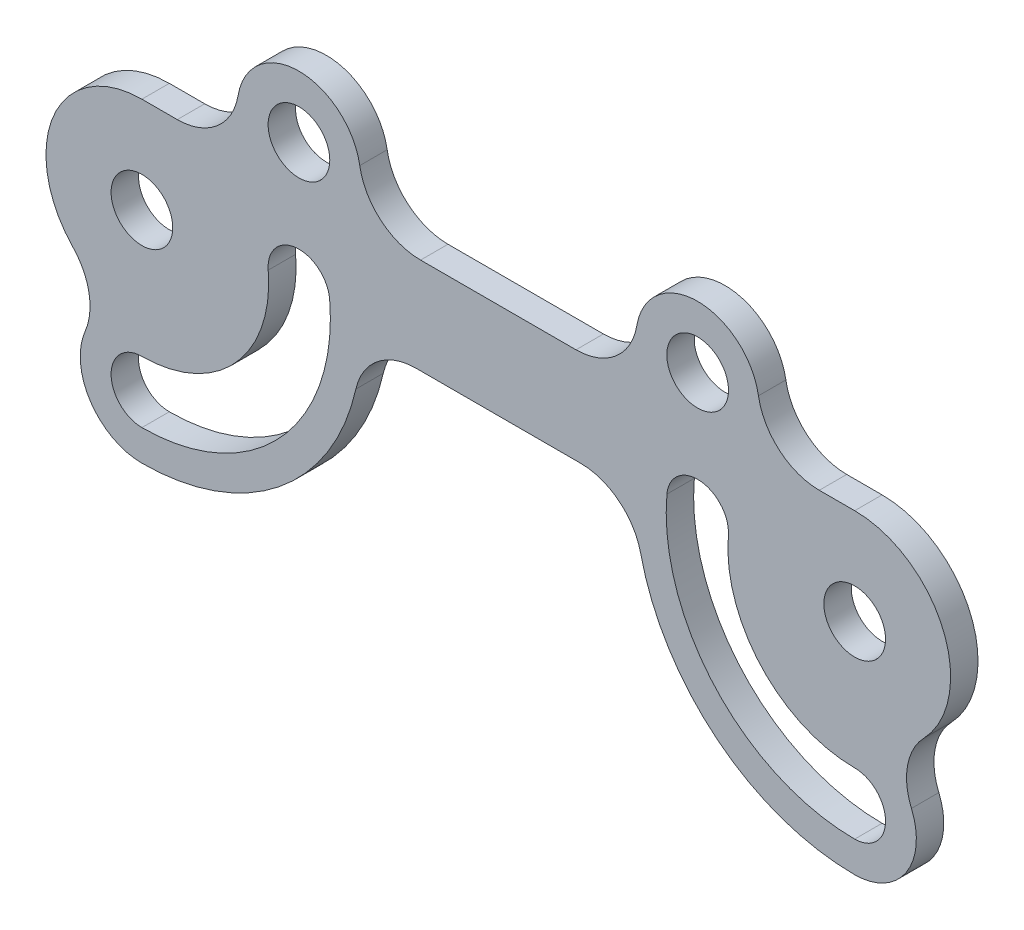
ISO-10303-21;
HEADER;
FILE_DESCRIPTION(('STEP AP214'),'2;1');
FILE_NAME('part.step','',(''),(''),'','','');
FILE_SCHEMA(('AUTOMOTIVE_DESIGN { 1 0 10303 214 1 1 1 1 }'));
ENDSEC;
DATA;
#1=APPLICATION_CONTEXT('core data for automotive mechanical design processes');
#2=APPLICATION_PROTOCOL_DEFINITION('international standard','automotive_design',2000,#1);
#3=PRODUCT_CONTEXT('',#1,'mechanical');
#4=PRODUCT('Part','Part','',(#3));
#5=PRODUCT_RELATED_PRODUCT_CATEGORY('part','',(#4));
#6=PRODUCT_DEFINITION_FORMATION('','',#4);
#7=PRODUCT_DEFINITION_CONTEXT('part definition',#1,'design');
#8=PRODUCT_DEFINITION('design','',#6,#7);
#9=PRODUCT_DEFINITION_SHAPE('','',#8);
#10=(LENGTH_UNIT() NAMED_UNIT(*) SI_UNIT(.MILLI.,.METRE.));
#11=(NAMED_UNIT(*) PLANE_ANGLE_UNIT() SI_UNIT($,.RADIAN.));
#12=(NAMED_UNIT(*) SI_UNIT($,.STERADIAN.) SOLID_ANGLE_UNIT());
#13=UNCERTAINTY_MEASURE_WITH_UNIT(LENGTH_MEASURE(1.E-05),#10,'distance_accuracy_value','');
#14=(GEOMETRIC_REPRESENTATION_CONTEXT(3) GLOBAL_UNCERTAINTY_ASSIGNED_CONTEXT((#13)) GLOBAL_UNIT_ASSIGNED_CONTEXT((#10,
#11,#12)) REPRESENTATION_CONTEXT('',''));
#15=CARTESIAN_POINT('',(0.,0.,0.));
#16=DIRECTION('',(0.,0.,1.));
#17=DIRECTION('',(1.,0.,0.));
#18=AXIS2_PLACEMENT_3D('',#15,#16,#17);
#19=CARTESIAN_POINT('',(0.,-9.128125,1.5875));
#20=DIRECTION('',(0.,0.,-1.));
#21=DIRECTION('',(-1.,0.,0.));
#22=AXIS2_PLACEMENT_3D('',#19,#20,#21);
#23=CYLINDRICAL_SURFACE('',#22,1.7859375);
#24=CARTESIAN_POINT('',(0.,-9.128125,0.));
#25=DIRECTION('',(0.,0.,1.));
#26=DIRECTION('',(1.,0.,0.));
#27=AXIS2_PLACEMENT_3D('',#24,#25,#26);
#28=CIRCLE('',#27,1.7859375);
#29=CARTESIAN_POINT('',(0.,-7.3421875,0.));
#30=VERTEX_POINT('',#29);
#31=CARTESIAN_POINT('',(0.,-10.9140625,0.));
#32=VERTEX_POINT('',#31);
#33=EDGE_CURVE('E386',#30,#32,#28,.T.);
#34=ORIENTED_EDGE('',*,*,#33,.F.);
#35=DIRECTION('',(0.,0.,-1.));
#36=VECTOR('',#35,1.);
#37=CARTESIAN_POINT('',(0.,-7.3421875,1.5875));
#38=LINE('',#37,#36);
#39=CARTESIAN_POINT('',(0.,-7.3421875,1.5875));
#40=VERTEX_POINT('',#39);
#41=EDGE_CURVE('E427',#40,#30,#38,.T.);
#42=ORIENTED_EDGE('',*,*,#41,.F.);
#43=CARTESIAN_POINT('',(0.,-9.128125,1.5875));
#44=DIRECTION('',(0.,0.,1.));
#45=DIRECTION('',(1.,0.,0.));
#46=AXIS2_PLACEMENT_3D('',#43,#44,#45);
#47=CIRCLE('',#46,1.7859375);
#48=CARTESIAN_POINT('',(0.,-10.9140625,1.5875));
#49=VERTEX_POINT('',#48);
#50=EDGE_CURVE('E301',#40,#49,#47,.T.);
#51=ORIENTED_EDGE('',*,*,#50,.T.);
#52=DIRECTION('',(0.,0.,-1.));
#53=VECTOR('',#52,1.);
#54=CARTESIAN_POINT('',(0.,-10.9140625,1.5875));
#55=LINE('',#54,#53);
#56=EDGE_CURVE('E417',#49,#32,#55,.T.);
#57=ORIENTED_EDGE('',*,*,#56,.T.);
#58=EDGE_LOOP('',(#34,#42,#51,#57));
#59=FACE_BOUND('',#58,.T.);
#60=ADVANCED_FACE('F41',(#59),#23,.F.);
#61=CARTESIAN_POINT('',(0.,0.,1.5875));
#62=DIRECTION('',(0.,0.,-1.));
#63=DIRECTION('',(-1.,0.,0.));
#64=AXIS2_PLACEMENT_3D('',#61,#62,#63);
#65=CYLINDRICAL_SURFACE('',#64,7.3421875);
#66=CARTESIAN_POINT('',(0.,0.,0.));
#67=DIRECTION('',(0.,0.,1.));
#68=DIRECTION('',(1.,0.,0.));
#69=AXIS2_PLACEMENT_3D('',#66,#67,#68);
#70=CIRCLE('',#69,7.3421875);
#71=CARTESIAN_POINT('',(7.31424825989549,0.639913804955099,0.));
#72=VERTEX_POINT('',#71);
#73=EDGE_CURVE('E390',#30,#72,#70,.T.);
#74=ORIENTED_EDGE('',*,*,#73,.T.);
#75=DIRECTION('',(0.,0.,-1.));
#76=VECTOR('',#75,1.);
#77=CARTESIAN_POINT('',(7.31424825989549,0.639913804955099,1.5875));
#78=LINE('',#77,#76);
#79=CARTESIAN_POINT('',(7.31424825989549,0.639913804955099,1.5875));
#80=VERTEX_POINT('',#79);
#81=EDGE_CURVE('E424',#80,#72,#78,.T.);
#82=ORIENTED_EDGE('',*,*,#81,.F.);
#83=CARTESIAN_POINT('',(0.,0.,1.5875));
#84=DIRECTION('',(0.,0.,1.));
#85=DIRECTION('',(1.,0.,0.));
#86=AXIS2_PLACEMENT_3D('',#83,#84,#85);
#87=CIRCLE('',#86,7.3421875);
#88=EDGE_CURVE('E305',#40,#80,#87,.T.);
#89=ORIENTED_EDGE('',*,*,#88,.F.);
#90=ORIENTED_EDGE('',*,*,#41,.T.);
#91=EDGE_LOOP('',(#74,#82,#89,#90));
#92=FACE_BOUND('',#91,.T.);
#93=ADVANCED_FACE('F613',(#92),#65,.T.);
#94=CARTESIAN_POINT('',(9.09338972851871,0.795568514268501,1.5875));
#95=DIRECTION('',(0.,0.,-1.));
#96=DIRECTION('',(-1.,0.,0.));
#97=AXIS2_PLACEMENT_3D('',#94,#95,#96);
#98=CYLINDRICAL_SURFACE('',#97,1.7859375);
#99=CARTESIAN_POINT('',(9.09338972851871,0.795568514268501,0.));
#100=DIRECTION('',(0.,0.,1.));
#101=DIRECTION('',(1.,0.,0.));
#102=AXIS2_PLACEMENT_3D('',#99,#100,#101);
#103=CIRCLE('',#102,1.7859375);
#104=CARTESIAN_POINT('',(10.8725311971419,0.951223223581904,0.));
#105=VERTEX_POINT('',#104);
#106=EDGE_CURVE('E394',#105,#72,#103,.T.);
#107=ORIENTED_EDGE('',*,*,#106,.F.);
#108=DIRECTION('',(0.,0.,-1.));
#109=VECTOR('',#108,1.);
#110=CARTESIAN_POINT('',(10.8725311971419,0.951223223581904,1.5875));
#111=LINE('',#110,#109);
#112=CARTESIAN_POINT('',(10.8725311971419,0.951223223581904,1.5875));
#113=VERTEX_POINT('',#112);
#114=EDGE_CURVE('E420',#113,#105,#111,.T.);
#115=ORIENTED_EDGE('',*,*,#114,.F.);
#116=CARTESIAN_POINT('',(9.09338972851871,0.795568514268501,1.5875));
#117=DIRECTION('',(0.,0.,1.));
#118=DIRECTION('',(1.,0.,0.));
#119=AXIS2_PLACEMENT_3D('',#116,#117,#118);
#120=CIRCLE('',#119,1.7859375);
#121=EDGE_CURVE('E308',#113,#80,#120,.T.);
#122=ORIENTED_EDGE('',*,*,#121,.T.);
#123=ORIENTED_EDGE('',*,*,#81,.T.);
#124=EDGE_LOOP('',(#107,#115,#122,#123));
#125=FACE_BOUND('',#124,.T.);
#126=ADVANCED_FACE('F619',(#125),#98,.F.);
#127=CARTESIAN_POINT('',(0.,0.,1.5875));
#128=DIRECTION('',(0.,0.,-1.));
#129=DIRECTION('',(-1.,0.,0.));
#130=AXIS2_PLACEMENT_3D('',#127,#128,#129);
#131=CYLINDRICAL_SURFACE('',#130,5.55625);
#132=CARTESIAN_POINT('',(0.,0.,0.));
#133=DIRECTION('',(0.,0.,1.));
#134=DIRECTION('',(1.,0.,0.));
#135=AXIS2_PLACEMENT_3D('',#132,#133,#134);
#136=CIRCLE('',#135,5.55625);
#137=CARTESIAN_POINT('',(0.,5.55625,0.));
#138=VERTEX_POINT('',#137);
#139=CARTESIAN_POINT('',(-4.0016363402321,-3.8547140831758,0.));
#140=VERTEX_POINT('',#139);
#141=EDGE_CURVE('E346',#138,#140,#136,.T.);
#142=ORIENTED_EDGE('',*,*,#141,.T.);
#143=DIRECTION('',(0.,0.,-1.));
#144=VECTOR('',#143,1.);
#145=CARTESIAN_POINT('',(-4.0016363402321,-3.8547140831758,1.5875));
#146=LINE('',#145,#144);
#147=CARTESIAN_POINT('',(-4.0016363402321,-3.8547140831758,1.5875));
#148=VERTEX_POINT('',#147);
#149=EDGE_CURVE('E499',#140,#148,#146,.F.);
#150=ORIENTED_EDGE('',*,*,#149,.T.);
#151=CARTESIAN_POINT('',(0.,0.,1.5875));
#152=DIRECTION('',(0.,0.,1.));
#153=DIRECTION('',(1.,0.,0.));
#154=AXIS2_PLACEMENT_3D('',#151,#152,#153);
#155=CIRCLE('',#154,5.55625);
#156=CARTESIAN_POINT('',(0.,5.55625,1.5875));
#157=VERTEX_POINT('',#156);
#158=EDGE_CURVE('E262',#157,#148,#155,.T.);
#159=ORIENTED_EDGE('',*,*,#158,.F.);
#160=DIRECTION('',(0.,0.,-1.));
#161=VECTOR('',#160,1.);
#162=CARTESIAN_POINT('',(0.,5.55625,1.5875));
#163=LINE('',#162,#161);
#164=EDGE_CURVE('E250',#157,#138,#163,.T.);
#165=ORIENTED_EDGE('',*,*,#164,.T.);
#166=EDGE_LOOP('',(#142,#150,#159,#165));
#167=FACE_BOUND('',#166,.T.);
#168=ADVANCED_FACE('F654',(#167),#131,.T.);
#169=CARTESIAN_POINT('',(0.,-9.128125,1.5875));
#170=DIRECTION('',(0.,0.,-1.));
#171=DIRECTION('',(-1.,0.,0.));
#172=AXIS2_PLACEMENT_3D('',#169,#170,#171);
#173=CYLINDRICAL_SURFACE('',#172,3.571875);
#174=CARTESIAN_POINT('',(0.,-9.128125,1.5875));
#175=DIRECTION('',(0.,0.,1.));
#176=DIRECTION('',(1.,0.,0.));
#177=AXIS2_PLACEMENT_3D('',#174,#175,#176);
#178=CIRCLE('',#177,3.571875);
#179=CARTESIAN_POINT('',(-3.28705842233351,-7.73043478260869,1.5875));
#180=VERTEX_POINT('',#179);
#181=CARTESIAN_POINT('',(0.,-12.7,1.5875));
#182=VERTEX_POINT('',#181);
#183=EDGE_CURVE('E266',#180,#182,#178,.T.);
#184=ORIENTED_EDGE('',*,*,#183,.F.);
#185=DIRECTION('',(0.,0.,-1.));
#186=VECTOR('',#185,1.);
#187=CARTESIAN_POINT('',(-3.28705842233351,-7.73043478260869,1.5875));
#188=LINE('',#187,#186);
#189=CARTESIAN_POINT('',(-3.28705842233351,-7.73043478260869,0.));
#190=VERTEX_POINT('',#189);
#191=EDGE_CURVE('E495',#180,#190,#188,.T.);
#192=ORIENTED_EDGE('',*,*,#191,.T.);
#193=CARTESIAN_POINT('',(0.,-9.128125,0.));
#194=DIRECTION('',(0.,0.,1.));
#195=DIRECTION('',(1.,0.,0.));
#196=AXIS2_PLACEMENT_3D('',#193,#194,#195);
#197=CIRCLE('',#196,3.571875);
#198=CARTESIAN_POINT('',(0.,-12.7,0.));
#199=VERTEX_POINT('',#198);
#200=EDGE_CURVE('E350',#190,#199,#197,.T.);
#201=ORIENTED_EDGE('',*,*,#200,.T.);
#202=DIRECTION('',(0.,0.,-1.));
#203=VECTOR('',#202,1.);
#204=CARTESIAN_POINT('',(0.,-12.7,1.5875));
#205=LINE('',#204,#203);
#206=EDGE_CURVE('E421',#182,#199,#205,.T.);
#207=ORIENTED_EDGE('',*,*,#206,.F.);
#208=EDGE_LOOP('',(#184,#192,#201,#207));
#209=FACE_BOUND('',#208,.T.);
#210=ADVANCED_FACE('F650',(#209),#173,.T.);
#211=CARTESIAN_POINT('',(0.,0.,1.5875));
#212=DIRECTION('',(0.,0.,-1.));
#213=DIRECTION('',(-1.,0.,0.));
#214=AXIS2_PLACEMENT_3D('',#211,#212,#213);
#215=CYLINDRICAL_SURFACE('',#214,12.7);
#216=CARTESIAN_POINT('',(0.,0.,0.));
#217=DIRECTION('',(0.,0.,1.));
#218=DIRECTION('',(1.,0.,0.));
#219=AXIS2_PLACEMENT_3D('',#216,#217,#218);
#220=CIRCLE('',#219,12.7);
#221=CARTESIAN_POINT('',(12.390243902439,-2.78780487804878,0.));
#222=VERTEX_POINT('',#221);
#223=EDGE_CURVE('E353',#199,#222,#220,.T.);
#224=ORIENTED_EDGE('',*,*,#223,.T.);
#225=DIRECTION('',(0.,0.,-1.));
#226=VECTOR('',#225,1.);
#227=CARTESIAN_POINT('',(12.390243902439,-2.78780487804878,1.5875));
#228=LINE('',#227,#226);
#229=CARTESIAN_POINT('',(12.390243902439,-2.78780487804878,1.5875));
#230=VERTEX_POINT('',#229);
#231=EDGE_CURVE('E488',#222,#230,#228,.F.);
#232=ORIENTED_EDGE('',*,*,#231,.T.);
#233=CARTESIAN_POINT('',(0.,0.,1.5875));
#234=DIRECTION('',(0.,0.,1.));
#235=DIRECTION('',(1.,0.,0.));
#236=AXIS2_PLACEMENT_3D('',#233,#234,#235);
#237=CIRCLE('',#236,12.7);
#238=EDGE_CURVE('E269',#182,#230,#237,.T.);
#239=ORIENTED_EDGE('',*,*,#238,.F.);
#240=ORIENTED_EDGE('',*,*,#206,.T.);
#241=EDGE_LOOP('',(#224,#232,#239,#240));
#242=FACE_BOUND('',#241,.T.);
#243=ADVANCED_FACE('F646',(#242),#215,.T.);
#244=CARTESIAN_POINT('',(0.,0.,1.5875));
#245=DIRECTION('',(0.,1.,0.));
#246=DIRECTION('',(0.,0.,1.));
#247=AXIS2_PLACEMENT_3D('',#244,#245,#246);
#248=PLANE('',#247);
#249=DIRECTION('',(1.,0.,0.));
#250=VECTOR('',#249,1.);
#251=CARTESIAN_POINT('',(0.,0.,1.5875));
#252=LINE('',#251,#250);
#253=CARTESIAN_POINT('',(15.875,0.,1.5875));
#254=VERTEX_POINT('',#253);
#255=CARTESIAN_POINT('',(25.4,0.,1.5875));
#256=VERTEX_POINT('',#255);
#257=EDGE_CURVE('E273',#254,#256,#252,.T.);
#258=ORIENTED_EDGE('',*,*,#257,.F.);
#259=DIRECTION('',(0.,0.,1.));
#260=VECTOR('',#259,1.);
#261=CARTESIAN_POINT('',(15.875,0.,0.));
#262=LINE('',#261,#260);
#263=CARTESIAN_POINT('',(15.875,0.,0.));
#264=VERTEX_POINT('',#263);
#265=EDGE_CURVE('E484',#254,#264,#262,.F.);
#266=ORIENTED_EDGE('',*,*,#265,.T.);
#267=DIRECTION('',(1.,0.,0.));
#268=VECTOR('',#267,1.);
#269=CARTESIAN_POINT('',(0.,0.,0.));
#270=LINE('',#269,#268);
#271=CARTESIAN_POINT('',(25.4,0.,0.));
#272=VERTEX_POINT('',#271);
#273=EDGE_CURVE('E357',#264,#272,#270,.T.);
#274=ORIENTED_EDGE('',*,*,#273,.T.);
#275=DIRECTION('',(0.,0.,1.));
#276=VECTOR('',#275,1.);
#277=CARTESIAN_POINT('',(25.4,0.,1.5875));
#278=LINE('',#277,#276);
#279=EDGE_CURVE('E481',#272,#256,#278,.T.);
#280=ORIENTED_EDGE('',*,*,#279,.T.);
#281=EDGE_LOOP('',(#258,#266,#274,#280));
#282=FACE_BOUND('',#281,.T.);
#283=ADVANCED_FACE('F642',(#282),#248,.F.);
#284=CARTESIAN_POINT('',(41.275,0.,1.5875));
#285=DIRECTION('',(0.,0.,-1.));
#286=DIRECTION('',(-1.,0.,0.));
#287=AXIS2_PLACEMENT_3D('',#284,#285,#286);
#288=CYLINDRICAL_SURFACE('',#287,12.7);
#289=CARTESIAN_POINT('',(41.275,0.,1.5875));
#290=DIRECTION('',(0.,0.,1.));
#291=DIRECTION('',(1.,0.,0.));
#292=AXIS2_PLACEMENT_3D('',#289,#290,#291);
#293=CIRCLE('',#292,12.7);
#294=CARTESIAN_POINT('',(28.884756097561,-2.78780487804878,1.5875));
#295=VERTEX_POINT('',#294);
#296=CARTESIAN_POINT('',(41.275,-12.7,1.5875));
#297=VERTEX_POINT('',#296);
#298=EDGE_CURVE('E277',#295,#297,#293,.T.);
#299=ORIENTED_EDGE('',*,*,#298,.F.);
#300=DIRECTION('',(0.,0.,-1.));
#301=VECTOR('',#300,1.);
#302=CARTESIAN_POINT('',(28.884756097561,-2.78780487804878,1.5875));
#303=LINE('',#302,#301);
#304=CARTESIAN_POINT('',(28.884756097561,-2.78780487804878,0.));
#305=VERTEX_POINT('',#304);
#306=EDGE_CURVE('E491',#295,#305,#303,.T.);
#307=ORIENTED_EDGE('',*,*,#306,.T.);
#308=CARTESIAN_POINT('',(41.275,0.,0.));
#309=DIRECTION('',(0.,0.,1.));
#310=DIRECTION('',(1.,0.,0.));
#311=AXIS2_PLACEMENT_3D('',#308,#309,#310);
#312=CIRCLE('',#311,12.7);
#313=CARTESIAN_POINT('',(41.275,-12.7,0.));
#314=VERTEX_POINT('',#313);
#315=EDGE_CURVE('E361',#305,#314,#312,.T.);
#316=ORIENTED_EDGE('',*,*,#315,.T.);
#317=DIRECTION('',(0.,0.,-1.));
#318=VECTOR('',#317,1.);
#319=CARTESIAN_POINT('',(41.275,-12.7,1.5875));
#320=LINE('',#319,#318);
#321=EDGE_CURVE('E437',#297,#314,#320,.T.);
#322=ORIENTED_EDGE('',*,*,#321,.F.);
#323=EDGE_LOOP('',(#299,#307,#316,#322));
#324=FACE_BOUND('',#323,.T.);
#325=ADVANCED_FACE('F638',(#324),#288,.T.);
#326=CARTESIAN_POINT('',(41.275,-9.128125,1.5875));
#327=DIRECTION('',(0.,0.,-1.));
#328=DIRECTION('',(-1.,0.,0.));
#329=AXIS2_PLACEMENT_3D('',#326,#327,#328);
#330=CYLINDRICAL_SURFACE('',#329,3.571875);
#331=CARTESIAN_POINT('',(41.275,-9.128125,0.));
#332=DIRECTION('',(0.,0.,1.));
#333=DIRECTION('',(1.,0.,0.));
#334=AXIS2_PLACEMENT_3D('',#331,#332,#333);
#335=CIRCLE('',#334,3.571875);
#336=CARTESIAN_POINT('',(44.5620584223335,-7.7304347826087,0.));
#337=VERTEX_POINT('',#336);
#338=EDGE_CURVE('E364',#314,#337,#335,.T.);
#339=ORIENTED_EDGE('',*,*,#338,.T.);
#340=DIRECTION('',(0.,0.,-1.));
#341=VECTOR('',#340,1.);
#342=CARTESIAN_POINT('',(44.5620584223335,-7.7304347826087,1.5875));
#343=LINE('',#342,#341);
#344=CARTESIAN_POINT('',(44.5620584223335,-7.7304347826087,1.5875));
#345=VERTEX_POINT('',#344);
#346=EDGE_CURVE('E454',#337,#345,#343,.F.);
#347=ORIENTED_EDGE('',*,*,#346,.T.);
#348=CARTESIAN_POINT('',(41.275,-9.128125,1.5875));
#349=DIRECTION('',(0.,0.,1.));
#350=DIRECTION('',(1.,0.,0.));
#351=AXIS2_PLACEMENT_3D('',#348,#349,#350);
#352=CIRCLE('',#351,3.571875);
#353=EDGE_CURVE('E280',#297,#345,#352,.T.);
#354=ORIENTED_EDGE('',*,*,#353,.F.);
#355=ORIENTED_EDGE('',*,*,#321,.T.);
#356=EDGE_LOOP('',(#339,#347,#354,#355));
#357=FACE_BOUND('',#356,.T.);
#358=ADVANCED_FACE('F635',(#357),#330,.T.);
#359=CARTESIAN_POINT('',(41.275,0.,1.5875));
#360=DIRECTION('',(0.,0.,-1.));
#361=DIRECTION('',(-1.,0.,0.));
#362=AXIS2_PLACEMENT_3D('',#359,#360,#361);
#363=CYLINDRICAL_SURFACE('',#362,5.55625);
#364=CARTESIAN_POINT('',(41.275,0.,1.5875));
#365=DIRECTION('',(0.,0.,1.));
#366=DIRECTION('',(1.,0.,0.));
#367=AXIS2_PLACEMENT_3D('',#364,#365,#366);
#368=CIRCLE('',#367,5.55625);
#369=CARTESIAN_POINT('',(45.2766363402321,-3.8547140831758,1.5875));
#370=VERTEX_POINT('',#369);
#371=CARTESIAN_POINT('',(41.275,5.55625,1.5875));
#372=VERTEX_POINT('',#371);
#373=EDGE_CURVE('E284',#370,#372,#368,.T.);
#374=ORIENTED_EDGE('',*,*,#373,.F.);
#375=DIRECTION('',(0.,0.,-1.));
#376=VECTOR('',#375,1.);
#377=CARTESIAN_POINT('',(45.2766363402321,-3.8547140831758,1.5875));
#378=LINE('',#377,#376);
#379=CARTESIAN_POINT('',(45.2766363402321,-3.8547140831758,0.));
#380=VERTEX_POINT('',#379);
#381=EDGE_CURVE('E430',#370,#380,#378,.T.);
#382=ORIENTED_EDGE('',*,*,#381,.T.);
#383=CARTESIAN_POINT('',(41.275,0.,0.));
#384=DIRECTION('',(0.,0.,1.));
#385=DIRECTION('',(1.,0.,0.));
#386=AXIS2_PLACEMENT_3D('',#383,#384,#385);
#387=CIRCLE('',#386,5.55625);
#388=CARTESIAN_POINT('',(41.275,5.55625,0.));
#389=VERTEX_POINT('',#388);
#390=EDGE_CURVE('E368',#380,#389,#387,.T.);
#391=ORIENTED_EDGE('',*,*,#390,.T.);
#392=DIRECTION('',(0.,0.,-1.));
#393=VECTOR('',#392,1.);
#394=CARTESIAN_POINT('',(41.275,5.55625,1.5875));
#395=LINE('',#394,#393);
#396=EDGE_CURVE('E433',#372,#389,#395,.T.);
#397=ORIENTED_EDGE('',*,*,#396,.F.);
#398=EDGE_LOOP('',(#374,#382,#391,#397));
#399=FACE_BOUND('',#398,.T.);
#400=ADVANCED_FACE('F575',(#399),#363,.T.);
#401=CARTESIAN_POINT('',(0.,5.55625,1.5875));
#402=DIRECTION('',(0.,1.,0.));
#403=DIRECTION('',(0.,0.,1.));
#404=AXIS2_PLACEMENT_3D('',#401,#402,#403);
#405=PLANE('',#404);
#406=DIRECTION('',(1.,0.,0.));
#407=VECTOR('',#406,1.);
#408=CARTESIAN_POINT('',(0.,5.55625,0.));
#409=LINE('',#408,#407);
#410=CARTESIAN_POINT('',(39.2257499068081,5.55625,0.));
#411=VERTEX_POINT('',#410);
#412=EDGE_CURVE('E372',#411,#389,#409,.T.);
#413=ORIENTED_EDGE('',*,*,#412,.F.);
#414=DIRECTION('',(0.,0.,-1.));
#415=VECTOR('',#414,1.);
#416=CARTESIAN_POINT('',(39.2257499068081,5.55625,1.5875));
#417=LINE('',#416,#415);
#418=CARTESIAN_POINT('',(39.2257499068081,5.55625,1.5875));
#419=VERTEX_POINT('',#418);
#420=EDGE_CURVE('E464',#411,#419,#417,.F.);
#421=ORIENTED_EDGE('',*,*,#420,.T.);
#422=DIRECTION('',(1.,0.,0.));
#423=VECTOR('',#422,1.);
#424=CARTESIAN_POINT('',(0.,5.55625,1.5875));
#425=LINE('',#424,#423);
#426=EDGE_CURVE('E288',#419,#372,#425,.T.);
#427=ORIENTED_EDGE('',*,*,#426,.T.);
#428=ORIENTED_EDGE('',*,*,#396,.T.);
#429=EDGE_LOOP('',(#413,#421,#427,#428));
#430=FACE_BOUND('',#429,.T.);
#431=ADVANCED_FACE('F566',(#430),#405,.T.);
#432=CARTESIAN_POINT('',(32.1816102714813,7.93931851426843,1.5875));
#433=DIRECTION('',(0.,0.,-1.));
#434=DIRECTION('',(-1.,0.,0.));
#435=AXIS2_PLACEMENT_3D('',#432,#433,#434);
#436=CYLINDRICAL_SURFACE('',#435,3.571875);
#437=CARTESIAN_POINT('',(32.1816102714813,7.93931851426843,1.5875));
#438=DIRECTION('',(0.,0.,1.));
#439=DIRECTION('',(1.,0.,0.));
#440=AXIS2_PLACEMENT_3D('',#437,#438,#439);
#441=CIRCLE('',#440,3.571875);
#442=CARTESIAN_POINT('',(35.7036800891447,8.53372175713422,1.5875));
#443=VERTEX_POINT('',#442);
#444=CARTESIAN_POINT('',(28.6595404538179,8.53372175713422,1.5875));
#445=VERTEX_POINT('',#444);
#446=EDGE_CURVE('E294',#443,#445,#441,.T.);
#447=ORIENTED_EDGE('',*,*,#446,.F.);
#448=DIRECTION('',(0.,0.,-1.));
#449=VECTOR('',#448,1.);
#450=CARTESIAN_POINT('',(35.7036800891447,8.53372175713422,1.5875));
#451=LINE('',#450,#449);
#452=CARTESIAN_POINT('',(35.7036800891447,8.53372175713422,0.));
#453=VERTEX_POINT('',#452);
#454=EDGE_CURVE('E460',#443,#453,#451,.T.);
#455=ORIENTED_EDGE('',*,*,#454,.T.);
#456=CARTESIAN_POINT('',(32.1816102714813,7.93931851426843,0.));
#457=DIRECTION('',(0.,0.,1.));
#458=DIRECTION('',(1.,0.,0.));
#459=AXIS2_PLACEMENT_3D('',#456,#457,#458);
#460=CIRCLE('',#459,3.571875);
#461=CARTESIAN_POINT('',(28.6595404538179,8.53372175713422,0.));
#462=VERTEX_POINT('',#461);
#463=EDGE_CURVE('E378',#453,#462,#460,.T.);
#464=ORIENTED_EDGE('',*,*,#463,.T.);
#465=DIRECTION('',(0.,0.,-1.));
#466=VECTOR('',#465,1.);
#467=CARTESIAN_POINT('',(28.6595404538179,8.53372175713422,1.5875));
#468=LINE('',#467,#466);
#469=EDGE_CURVE('E457',#462,#445,#468,.F.);
#470=ORIENTED_EDGE('',*,*,#469,.T.);
#471=EDGE_LOOP('',(#447,#455,#464,#470));
#472=FACE_BOUND('',#471,.T.);
#473=ADVANCED_FACE('F587',(#472),#436,.T.);
#474=CARTESIAN_POINT('',(16.1375293638456,5.55625,0.));
#475=VERTEX_POINT('',#474);
#476=CARTESIAN_POINT('',(25.1374706361544,5.55625,0.));
#477=VERTEX_POINT('',#476);
#478=EDGE_CURVE('E373',#475,#477,#409,.T.);
#479=ORIENTED_EDGE('',*,*,#478,.F.);
#480=DIRECTION('',(0.,0.,-1.));
#481=VECTOR('',#480,1.);
#482=CARTESIAN_POINT('',(16.1375293638456,5.55625,1.5875));
#483=LINE('',#482,#481);
#484=CARTESIAN_POINT('',(16.1375293638456,5.55625,1.5875));
#485=VERTEX_POINT('',#484);
#486=EDGE_CURVE('E478',#475,#485,#483,.F.);
#487=ORIENTED_EDGE('',*,*,#486,.T.);
#488=CARTESIAN_POINT('',(25.1374706361544,5.55625,1.5875));
#489=VERTEX_POINT('',#488);
#490=EDGE_CURVE('E289',#485,#489,#425,.T.);
#491=ORIENTED_EDGE('',*,*,#490,.T.);
#492=DIRECTION('',(0.,0.,-1.));
#493=VECTOR('',#492,1.);
#494=CARTESIAN_POINT('',(25.1374706361544,5.55625,1.5875));
#495=LINE('',#494,#493);
#496=EDGE_CURVE('E474',#489,#477,#495,.T.);
#497=ORIENTED_EDGE('',*,*,#496,.T.);
#498=EDGE_LOOP('',(#479,#487,#491,#497));
#499=FACE_BOUND('',#498,.T.);
#500=ADVANCED_FACE('F596',(#499),#405,.T.);
#501=CARTESIAN_POINT('',(9.09338972851871,7.9393185142685,1.5875));
#502=DIRECTION('',(0.,0.,-1.));
#503=DIRECTION('',(-1.,0.,0.));
#504=AXIS2_PLACEMENT_3D('',#501,#502,#503);
#505=CYLINDRICAL_SURFACE('',#504,3.571875);
#506=CARTESIAN_POINT('',(9.09338972851871,7.9393185142685,1.5875));
#507=DIRECTION('',(0.,0.,1.));
#508=DIRECTION('',(1.,0.,0.));
#509=AXIS2_PLACEMENT_3D('',#506,#507,#508);
#510=CIRCLE('',#509,3.571875);
#511=CARTESIAN_POINT('',(12.6154595461821,8.53372175713425,1.5875));
#512=VERTEX_POINT('',#511);
#513=CARTESIAN_POINT('',(5.57131991085528,8.53372175713425,1.5875));
#514=VERTEX_POINT('',#513);
#515=EDGE_CURVE('E293',#512,#514,#510,.T.);
#516=ORIENTED_EDGE('',*,*,#515,.F.);
#517=DIRECTION('',(0.,0.,-1.));
#518=VECTOR('',#517,1.);
#519=CARTESIAN_POINT('',(12.6154595461821,8.53372175713425,1.5875));
#520=LINE('',#519,#518);
#521=CARTESIAN_POINT('',(12.6154595461821,8.53372175713425,0.));
#522=VERTEX_POINT('',#521);
#523=EDGE_CURVE('E470',#512,#522,#520,.T.);
#524=ORIENTED_EDGE('',*,*,#523,.T.);
#525=CARTESIAN_POINT('',(9.09338972851871,7.9393185142685,0.));
#526=DIRECTION('',(0.,0.,1.));
#527=DIRECTION('',(1.,0.,0.));
#528=AXIS2_PLACEMENT_3D('',#525,#526,#527);
#529=CIRCLE('',#528,3.571875);
#530=CARTESIAN_POINT('',(5.57131991085528,8.53372175713425,0.));
#531=VERTEX_POINT('',#530);
#532=EDGE_CURVE('E377',#522,#531,#529,.T.);
#533=ORIENTED_EDGE('',*,*,#532,.T.);
#534=DIRECTION('',(0.,0.,-1.));
#535=VECTOR('',#534,1.);
#536=CARTESIAN_POINT('',(5.57131991085528,8.53372175713425,1.5875));
#537=LINE('',#536,#535);
#538=EDGE_CURVE('E467',#531,#514,#537,.F.);
#539=ORIENTED_EDGE('',*,*,#538,.T.);
#540=EDGE_LOOP('',(#516,#524,#533,#539));
#541=FACE_BOUND('',#540,.T.);
#542=ADVANCED_FACE('F556',(#541),#505,.T.);
#543=CARTESIAN_POINT('',(41.275,0.,1.5875));
#544=DIRECTION('',(0.,0.,-1.));
#545=DIRECTION('',(-1.,0.,0.));
#546=AXIS2_PLACEMENT_3D('',#543,#544,#545);
#547=CYLINDRICAL_SURFACE('',#546,7.3421875);
#548=CARTESIAN_POINT('',(41.275,0.,0.));
#549=DIRECTION('',(0.,0.,1.));
#550=DIRECTION('',(1.,0.,0.));
#551=AXIS2_PLACEMENT_3D('',#548,#549,#550);
#552=CIRCLE('',#551,7.3421875);
#553=CARTESIAN_POINT('',(33.9607517401045,0.639913804955042,0.));
#554=VERTEX_POINT('',#553);
#555=CARTESIAN_POINT('',(41.275,-7.3421875,0.));
#556=VERTEX_POINT('',#555);
#557=EDGE_CURVE('E245',#554,#556,#552,.T.);
#558=ORIENTED_EDGE('',*,*,#557,.T.);
#559=DIRECTION('',(0.,0.,-1.));
#560=VECTOR('',#559,1.);
#561=CARTESIAN_POINT('',(41.275,-7.3421875,1.5875));
#562=LINE('',#561,#560);
#563=CARTESIAN_POINT('',(41.275,-7.3421875,1.5875));
#564=VERTEX_POINT('',#563);
#565=EDGE_CURVE('E242',#564,#556,#562,.T.);
#566=ORIENTED_EDGE('',*,*,#565,.F.);
#567=CARTESIAN_POINT('',(41.275,0.,1.5875));
#568=DIRECTION('',(0.,0.,1.));
#569=DIRECTION('',(1.,0.,0.));
#570=AXIS2_PLACEMENT_3D('',#567,#568,#569);
#571=CIRCLE('',#570,7.3421875);
#572=CARTESIAN_POINT('',(33.9607517401045,0.639913804955042,1.5875));
#573=VERTEX_POINT('',#572);
#574=EDGE_CURVE('E228',#573,#564,#571,.T.);
#575=ORIENTED_EDGE('',*,*,#574,.F.);
#576=DIRECTION('',(0.,0.,-1.));
#577=VECTOR('',#576,1.);
#578=CARTESIAN_POINT('',(33.9607517401045,0.639913804955042,1.5875));
#579=LINE('',#578,#577);
#580=EDGE_CURVE('E332',#573,#554,#579,.T.);
#581=ORIENTED_EDGE('',*,*,#580,.T.);
#582=EDGE_LOOP('',(#558,#566,#575,#581));
#583=FACE_BOUND('',#582,.T.);
#584=ADVANCED_FACE('F243',(#583),#547,.T.);
#585=CARTESIAN_POINT('',(41.275,-9.128125,1.5875));
#586=DIRECTION('',(0.,0.,-1.));
#587=DIRECTION('',(-1.,0.,0.));
#588=AXIS2_PLACEMENT_3D('',#585,#586,#587);
#589=CYLINDRICAL_SURFACE('',#588,1.7859375);
#590=CARTESIAN_POINT('',(41.275,-9.128125,0.));
#591=DIRECTION('',(0.,0.,1.));
#592=DIRECTION('',(1.,0.,0.));
#593=AXIS2_PLACEMENT_3D('',#590,#591,#592);
#594=CIRCLE('',#593,1.7859375);
#595=CARTESIAN_POINT('',(41.275,-10.9140625,0.));
#596=VERTEX_POINT('',#595);
#597=EDGE_CURVE('E335',#596,#556,#594,.T.);
#598=ORIENTED_EDGE('',*,*,#597,.F.);
#599=DIRECTION('',(0.,0.,-1.));
#600=VECTOR('',#599,1.);
#601=CARTESIAN_POINT('',(41.275,-10.9140625,1.5875));
#602=LINE('',#601,#600);
#603=CARTESIAN_POINT('',(41.275,-10.9140625,1.5875));
#604=VERTEX_POINT('',#603);
#605=EDGE_CURVE('E251',#604,#596,#602,.T.);
#606=ORIENTED_EDGE('',*,*,#605,.F.);
#607=CARTESIAN_POINT('',(41.275,-9.128125,1.5875));
#608=DIRECTION('',(0.,0.,1.));
#609=DIRECTION('',(1.,0.,0.));
#610=AXIS2_PLACEMENT_3D('',#607,#608,#609);
#611=CIRCLE('',#610,1.7859375);
#612=EDGE_CURVE('E233',#604,#564,#611,.T.);
#613=ORIENTED_EDGE('',*,*,#612,.T.);
#614=ORIENTED_EDGE('',*,*,#565,.T.);
#615=EDGE_LOOP('',(#598,#606,#613,#614));
#616=FACE_BOUND('',#615,.T.);
#617=ADVANCED_FACE('F253',(#616),#589,.F.);
#618=CARTESIAN_POINT('',(41.275,0.,1.5875));
#619=DIRECTION('',(0.,0.,-1.));
#620=DIRECTION('',(-1.,0.,0.));
#621=AXIS2_PLACEMENT_3D('',#618,#619,#620);
#622=CYLINDRICAL_SURFACE('',#621,10.9140625);
#623=CARTESIAN_POINT('',(41.275,0.,0.));
#624=DIRECTION('',(0.,0.,1.));
#625=DIRECTION('',(1.,0.,0.));
#626=AXIS2_PLACEMENT_3D('',#623,#624,#625);
#627=CIRCLE('',#626,10.9140625);
#628=CARTESIAN_POINT('',(30.402468802858,0.951223223581821,0.));
#629=VERTEX_POINT('',#628);
#630=EDGE_CURVE('E338',#629,#596,#627,.T.);
#631=ORIENTED_EDGE('',*,*,#630,.F.);
#632=DIRECTION('',(0.,0.,-1.));
#633=VECTOR('',#632,1.);
#634=CARTESIAN_POINT('',(30.402468802858,0.951223223581821,1.5875));
#635=LINE('',#634,#633);
#636=CARTESIAN_POINT('',(30.402468802858,0.951223223581821,1.5875));
#637=VERTEX_POINT('',#636);
#638=EDGE_CURVE('E446',#637,#629,#635,.T.);
#639=ORIENTED_EDGE('',*,*,#638,.F.);
#640=CARTESIAN_POINT('',(41.275,0.,1.5875));
#641=DIRECTION('',(0.,0.,1.));
#642=DIRECTION('',(1.,0.,0.));
#643=AXIS2_PLACEMENT_3D('',#640,#641,#642);
#644=CIRCLE('',#643,10.9140625);
#645=EDGE_CURVE('E255',#637,#604,#644,.T.);
#646=ORIENTED_EDGE('',*,*,#645,.T.);
#647=ORIENTED_EDGE('',*,*,#605,.T.);
#648=EDGE_LOOP('',(#631,#639,#646,#647));
#649=FACE_BOUND('',#648,.T.);
#650=ADVANCED_FACE('F663',(#649),#622,.F.);
#651=CARTESIAN_POINT('',(9.09338972851871,7.9393185142685,1.5875));
#652=DIRECTION('',(0.,0.,-1.));
#653=DIRECTION('',(-1.,0.,0.));
#654=AXIS2_PLACEMENT_3D('',#651,#652,#653);
#655=CYLINDRICAL_SURFACE('',#654,1.7859375);
#656=CARTESIAN_POINT('',(9.09338972851871,7.9393185142685,1.5875));
#657=DIRECTION('',(0.,0.,1.));
#658=DIRECTION('',(1.,0.,0.));
#659=AXIS2_PLACEMENT_3D('',#656,#657,#658);
#660=CIRCLE('',#659,1.7859375);
#661=CARTESIAN_POINT('',(10.8793272285187,7.9393185142685,1.5875));
#662=VERTEX_POINT('',#661);
#663=EDGE_CURVE('E324',#662,#662,#660,.T.);
#664=ORIENTED_EDGE('',*,*,#663,.T.);
#665=EDGE_LOOP('',(#664));
#666=FACE_BOUND('',#665,.T.);
#667=CARTESIAN_POINT('',(9.09338972851871,7.9393185142685,0.));
#668=DIRECTION('',(0.,0.,1.));
#669=DIRECTION('',(1.,0.,0.));
#670=AXIS2_PLACEMENT_3D('',#667,#668,#669);
#671=CIRCLE('',#670,1.7859375);
#672=CARTESIAN_POINT('',(10.8793272285187,7.9393185142685,0.));
#673=VERTEX_POINT('',#672);
#674=EDGE_CURVE('E410',#673,#673,#671,.T.);
#675=ORIENTED_EDGE('',*,*,#674,.F.);
#676=EDGE_LOOP('',(#675));
#677=FACE_BOUND('',#676,.T.);
#678=ADVANCED_FACE('F666',(#666,#677),#655,.F.);
#679=CARTESIAN_POINT('',(41.275,0.,1.5875));
#680=DIRECTION('',(0.,0.,-1.));
#681=DIRECTION('',(-1.,0.,0.));
#682=AXIS2_PLACEMENT_3D('',#679,#680,#681);
#683=CYLINDRICAL_SURFACE('',#682,1.7859375);
#684=CARTESIAN_POINT('',(41.275,0.,1.5875));
#685=DIRECTION('',(0.,0.,1.));
#686=DIRECTION('',(1.,0.,0.));
#687=AXIS2_PLACEMENT_3D('',#684,#685,#686);
#688=CIRCLE('',#687,1.7859375);
#689=CARTESIAN_POINT('',(43.0609375,0.,1.5875));
#690=VERTEX_POINT('',#689);
#691=EDGE_CURVE('E320',#690,#690,#688,.T.);
#692=ORIENTED_EDGE('',*,*,#691,.T.);
#693=EDGE_LOOP('',(#692));
#694=FACE_BOUND('',#693,.T.);
#695=CARTESIAN_POINT('',(41.275,0.,0.));
#696=DIRECTION('',(0.,0.,1.));
#697=DIRECTION('',(1.,0.,0.));
#698=AXIS2_PLACEMENT_3D('',#695,#696,#697);
#699=CIRCLE('',#698,1.7859375);
#700=CARTESIAN_POINT('',(43.0609375,0.,0.));
#701=VERTEX_POINT('',#700);
#702=EDGE_CURVE('E406',#701,#701,#699,.T.);
#703=ORIENTED_EDGE('',*,*,#702,.F.);
#704=EDGE_LOOP('',(#703));
#705=FACE_BOUND('',#704,.T.);
#706=ADVANCED_FACE('F879',(#694,#705),#683,.F.);
#707=CARTESIAN_POINT('',(0.,0.,1.5875));
#708=DIRECTION('',(0.,0.,-1.));
#709=DIRECTION('',(-1.,0.,0.));
#710=AXIS2_PLACEMENT_3D('',#707,#708,#709);
#711=CYLINDRICAL_SURFACE('',#710,1.7859375);
#712=CARTESIAN_POINT('',(0.,0.,1.5875));
#713=DIRECTION('',(0.,0.,1.));
#714=DIRECTION('',(1.,0.,0.));
#715=AXIS2_PLACEMENT_3D('',#712,#713,#714);
#716=CIRCLE('',#715,1.7859375);
#717=CARTESIAN_POINT('',(1.7859375,0.,1.5875));
#718=VERTEX_POINT('',#717);
#719=EDGE_CURVE('E316',#718,#718,#716,.T.);
#720=ORIENTED_EDGE('',*,*,#719,.T.);
#721=EDGE_LOOP('',(#720));
#722=FACE_BOUND('',#721,.T.);
#723=CARTESIAN_POINT('',(0.,0.,0.));
#724=DIRECTION('',(0.,0.,1.));
#725=DIRECTION('',(1.,0.,0.));
#726=AXIS2_PLACEMENT_3D('',#723,#724,#725);
#727=CIRCLE('',#726,1.7859375);
#728=CARTESIAN_POINT('',(1.7859375,0.,0.));
#729=VERTEX_POINT('',#728);
#730=EDGE_CURVE('E402',#729,#729,#727,.T.);
#731=ORIENTED_EDGE('',*,*,#730,.F.);
#732=EDGE_LOOP('',(#731));
#733=FACE_BOUND('',#732,.T.);
#734=ADVANCED_FACE('F869',(#722,#733),#711,.F.);
#735=CARTESIAN_POINT('',(0.,0.,1.5875));
#736=DIRECTION('',(0.,0.,-1.));
#737=DIRECTION('',(-1.,0.,0.));
#738=AXIS2_PLACEMENT_3D('',#735,#736,#737);
#739=CYLINDRICAL_SURFACE('',#738,10.9140625);
#740=CARTESIAN_POINT('',(0.,0.,0.));
#741=DIRECTION('',(0.,0.,1.));
#742=DIRECTION('',(1.,0.,0.));
#743=AXIS2_PLACEMENT_3D('',#740,#741,#742);
#744=CIRCLE('',#743,10.9140625);
#745=EDGE_CURVE('E398',#32,#105,#744,.T.);
#746=ORIENTED_EDGE('',*,*,#745,.F.);
#747=ORIENTED_EDGE('',*,*,#56,.F.);
#748=CARTESIAN_POINT('',(0.,0.,1.5875));
#749=DIRECTION('',(0.,0.,1.));
#750=DIRECTION('',(1.,0.,0.));
#751=AXIS2_PLACEMENT_3D('',#748,#749,#750);
#752=CIRCLE('',#751,10.9140625);
#753=EDGE_CURVE('E312',#49,#113,#752,.T.);
#754=ORIENTED_EDGE('',*,*,#753,.T.);
#755=ORIENTED_EDGE('',*,*,#114,.T.);
#756=EDGE_LOOP('',(#746,#747,#754,#755));
#757=FACE_BOUND('',#756,.T.);
#758=ADVANCED_FACE('F628',(#757),#739,.F.);
#759=CARTESIAN_POINT('',(2.04925009319186,5.55625,1.5875));
#760=VERTEX_POINT('',#759);
#761=EDGE_CURVE('E295',#157,#760,#425,.T.);
#762=ORIENTED_EDGE('',*,*,#761,.T.);
#763=DIRECTION('',(0.,0.,-1.));
#764=VECTOR('',#763,1.);
#765=CARTESIAN_POINT('',(2.04925009319186,5.55625,1.5875));
#766=LINE('',#765,#764);
#767=CARTESIAN_POINT('',(2.04925009319186,5.55625,0.));
#768=VERTEX_POINT('',#767);
#769=EDGE_CURVE('E502',#760,#768,#766,.T.);
#770=ORIENTED_EDGE('',*,*,#769,.T.);
#771=EDGE_CURVE('E379',#138,#768,#409,.T.);
#772=ORIENTED_EDGE('',*,*,#771,.F.);
#773=ORIENTED_EDGE('',*,*,#164,.F.);
#774=EDGE_LOOP('',(#762,#770,#772,#773));
#775=FACE_BOUND('',#774,.T.);
#776=ADVANCED_FACE('F559',(#775),#405,.T.);
#777=CARTESIAN_POINT('',(32.1816102714813,0.795568514268431,1.5875));
#778=DIRECTION('',(0.,0.,-1.));
#779=DIRECTION('',(-1.,0.,0.));
#780=AXIS2_PLACEMENT_3D('',#777,#778,#779);
#781=CYLINDRICAL_SURFACE('',#780,1.7859375);
#782=CARTESIAN_POINT('',(32.1816102714813,0.795568514268431,0.));
#783=DIRECTION('',(0.,0.,1.));
#784=DIRECTION('',(1.,0.,0.));
#785=AXIS2_PLACEMENT_3D('',#782,#783,#784);
#786=CIRCLE('',#785,1.7859375);
#787=EDGE_CURVE('E342',#554,#629,#786,.T.);
#788=ORIENTED_EDGE('',*,*,#787,.F.);
#789=ORIENTED_EDGE('',*,*,#580,.F.);
#790=CARTESIAN_POINT('',(32.1816102714813,0.795568514268431,1.5875));
#791=DIRECTION('',(0.,0.,1.));
#792=DIRECTION('',(1.,0.,0.));
#793=AXIS2_PLACEMENT_3D('',#790,#791,#792);
#794=CIRCLE('',#793,1.7859375);
#795=EDGE_CURVE('E236',#573,#637,#794,.T.);
#796=ORIENTED_EDGE('',*,*,#795,.T.);
#797=ORIENTED_EDGE('',*,*,#638,.T.);
#798=EDGE_LOOP('',(#788,#789,#796,#797));
#799=FACE_BOUND('',#798,.T.);
#800=ADVANCED_FACE('F627',(#799),#781,.F.);
#801=CARTESIAN_POINT('',(32.1816102714813,7.93931851426843,1.5875));
#802=DIRECTION('',(0.,0.,-1.));
#803=DIRECTION('',(-1.,0.,0.));
#804=AXIS2_PLACEMENT_3D('',#801,#802,#803);
#805=CYLINDRICAL_SURFACE('',#804,1.7859375);
#806=CARTESIAN_POINT('',(32.1816102714813,7.93931851426843,1.5875));
#807=DIRECTION('',(0.,0.,1.));
#808=DIRECTION('',(1.,0.,0.));
#809=AXIS2_PLACEMENT_3D('',#806,#807,#808);
#810=CIRCLE('',#809,1.7859375);
#811=CARTESIAN_POINT('',(33.9675477714813,7.93931851426843,1.5875));
#812=VERTEX_POINT('',#811);
#813=EDGE_CURVE('E328',#812,#812,#810,.T.);
#814=ORIENTED_EDGE('',*,*,#813,.T.);
#815=EDGE_LOOP('',(#814));
#816=FACE_BOUND('',#815,.T.);
#817=CARTESIAN_POINT('',(32.1816102714813,7.93931851426843,0.));
#818=DIRECTION('',(0.,0.,1.));
#819=DIRECTION('',(1.,0.,0.));
#820=AXIS2_PLACEMENT_3D('',#817,#818,#819);
#821=CIRCLE('',#820,1.7859375);
#822=CARTESIAN_POINT('',(33.9675477714813,7.93931851426843,0.));
#823=VERTEX_POINT('',#822);
#824=EDGE_CURVE('E239',#823,#823,#821,.T.);
#825=ORIENTED_EDGE('',*,*,#824,.F.);
#826=EDGE_LOOP('',(#825));
#827=FACE_BOUND('',#826,.T.);
#828=ADVANCED_FACE('F661',(#816,#827),#805,.F.);
#829=CARTESIAN_POINT('',(0.,0.,1.5875));
#830=DIRECTION('',(0.,0.,1.));
#831=DIRECTION('',(1.,0.,0.));
#832=AXIS2_PLACEMENT_3D('',#829,#830,#831);
#833=PLANE('',#832);
#834=ORIENTED_EDGE('',*,*,#574,.T.);
#835=ORIENTED_EDGE('',*,*,#612,.F.);
#836=ORIENTED_EDGE('',*,*,#645,.F.);
#837=ORIENTED_EDGE('',*,*,#795,.F.);
#838=EDGE_LOOP('',(#834,#835,#836,#837));
#839=FACE_BOUND('',#838,.T.);
#840=ORIENTED_EDGE('',*,*,#158,.T.);
#841=CARTESIAN_POINT('',(-6.57411684466702,-6.33274456521739,1.5875));
#842=DIRECTION('',(0.,0.,1.));
#843=DIRECTION('',(1.,0.,0.));
#844=AXIS2_PLACEMENT_3D('',#841,#842,#843);
#845=CIRCLE('',#844,3.571875);
#846=EDGE_CURVE('E544',#148,#180,#845,.F.);
#847=ORIENTED_EDGE('',*,*,#846,.T.);
#848=ORIENTED_EDGE('',*,*,#183,.T.);
#849=ORIENTED_EDGE('',*,*,#238,.T.);
#850=CARTESIAN_POINT('',(15.875,-3.571875,1.5875));
#851=DIRECTION('',(0.,0.,1.));
#852=DIRECTION('',(1.,0.,0.));
#853=AXIS2_PLACEMENT_3D('',#850,#851,#852);
#854=CIRCLE('',#853,3.571875);
#855=EDGE_CURVE('E526',#230,#254,#854,.F.);
#856=ORIENTED_EDGE('',*,*,#855,.T.);
#857=ORIENTED_EDGE('',*,*,#257,.T.);
#858=CARTESIAN_POINT('',(25.4,-3.571875,1.5875));
#859=DIRECTION('',(0.,0.,1.));
#860=DIRECTION('',(1.,0.,0.));
#861=AXIS2_PLACEMENT_3D('',#858,#859,#860);
#862=CIRCLE('',#861,3.571875);
#863=EDGE_CURVE('E532',#256,#295,#862,.F.);
#864=ORIENTED_EDGE('',*,*,#863,.T.);
#865=ORIENTED_EDGE('',*,*,#298,.T.);
#866=ORIENTED_EDGE('',*,*,#353,.T.);
#867=CARTESIAN_POINT('',(47.849116844667,-6.33274456521739,1.5875));
#868=DIRECTION('',(0.,0.,1.));
#869=DIRECTION('',(1.,0.,0.));
#870=AXIS2_PLACEMENT_3D('',#867,#868,#869);
#871=CIRCLE('',#870,3.571875);
#872=EDGE_CURVE('E508',#345,#370,#871,.F.);
#873=ORIENTED_EDGE('',*,*,#872,.T.);
#874=ORIENTED_EDGE('',*,*,#373,.T.);
#875=ORIENTED_EDGE('',*,*,#426,.F.);
#876=CARTESIAN_POINT('',(39.2257499068081,9.128125,1.5875));
#877=DIRECTION('',(0.,0.,1.));
#878=DIRECTION('',(1.,0.,0.));
#879=AXIS2_PLACEMENT_3D('',#876,#877,#878);
#880=CIRCLE('',#879,3.571875);
#881=EDGE_CURVE('E514',#419,#443,#880,.F.);
#882=ORIENTED_EDGE('',*,*,#881,.T.);
#883=ORIENTED_EDGE('',*,*,#446,.T.);
#884=CARTESIAN_POINT('',(25.1374706361544,9.128125,1.5875));
#885=DIRECTION('',(0.,0.,1.));
#886=DIRECTION('',(1.,0.,0.));
#887=AXIS2_PLACEMENT_3D('',#884,#885,#886);
#888=CIRCLE('',#887,3.571875);
#889=EDGE_CURVE('E538',#445,#489,#888,.F.);
#890=ORIENTED_EDGE('',*,*,#889,.T.);
#891=ORIENTED_EDGE('',*,*,#490,.F.);
#892=CARTESIAN_POINT('',(16.1375293638456,9.128125,1.5875));
#893=DIRECTION('',(0.,0.,1.));
#894=DIRECTION('',(1.,0.,0.));
#895=AXIS2_PLACEMENT_3D('',#892,#893,#894);
#896=CIRCLE('',#895,3.571875);
#897=EDGE_CURVE('E520',#485,#512,#896,.F.);
#898=ORIENTED_EDGE('',*,*,#897,.T.);
#899=ORIENTED_EDGE('',*,*,#515,.T.);
#900=CARTESIAN_POINT('',(2.04925009319186,9.128125,1.5875));
#901=DIRECTION('',(0.,0.,1.));
#902=DIRECTION('',(1.,0.,0.));
#903=AXIS2_PLACEMENT_3D('',#900,#901,#902);
#904=CIRCLE('',#903,3.571875);
#905=EDGE_CURVE('E11',#514,#760,#904,.F.);
#906=ORIENTED_EDGE('',*,*,#905,.T.);
#907=ORIENTED_EDGE('',*,*,#761,.F.);
#908=EDGE_LOOP('',(#840,#847,#848,#849,#856,#857,#864,#865,#866,#873,#874,#875,#882,#883,#890,
#891,#898,#899,#906,#907));
#909=FACE_BOUND('',#908,.T.);
#910=ORIENTED_EDGE('',*,*,#50,.F.);
#911=ORIENTED_EDGE('',*,*,#88,.T.);
#912=ORIENTED_EDGE('',*,*,#121,.F.);
#913=ORIENTED_EDGE('',*,*,#753,.F.);
#914=EDGE_LOOP('',(#910,#911,#912,#913));
#915=FACE_BOUND('',#914,.T.);
#916=ORIENTED_EDGE('',*,*,#719,.F.);
#917=EDGE_LOOP('',(#916));
#918=FACE_BOUND('',#917,.T.);
#919=ORIENTED_EDGE('',*,*,#691,.F.);
#920=EDGE_LOOP('',(#919));
#921=FACE_BOUND('',#920,.T.);
#922=ORIENTED_EDGE('',*,*,#663,.F.);
#923=EDGE_LOOP('',(#922));
#924=FACE_BOUND('',#923,.T.);
#925=ORIENTED_EDGE('',*,*,#813,.F.);
#926=EDGE_LOOP('',(#925));
#927=FACE_BOUND('',#926,.T.);
#928=ADVANCED_FACE('F230',(#839,#909,#915,#918,#921,#924,#927),#833,.T.);
#929=CARTESIAN_POINT('',(0.,0.,0.));
#930=DIRECTION('',(0.,0.,1.));
#931=DIRECTION('',(1.,0.,0.));
#932=AXIS2_PLACEMENT_3D('',#929,#930,#931);
#933=PLANE('',#932);
#934=ORIENTED_EDGE('',*,*,#557,.F.);
#935=ORIENTED_EDGE('',*,*,#787,.T.);
#936=ORIENTED_EDGE('',*,*,#630,.T.);
#937=ORIENTED_EDGE('',*,*,#597,.T.);
#938=EDGE_LOOP('',(#934,#935,#936,#937));
#939=FACE_BOUND('',#938,.T.);
#940=ORIENTED_EDGE('',*,*,#141,.F.);
#941=ORIENTED_EDGE('',*,*,#771,.T.);
#942=CARTESIAN_POINT('',(2.04925009319186,9.128125,0.));
#943=DIRECTION('',(0.,0.,1.));
#944=DIRECTION('',(1.,0.,0.));
#945=AXIS2_PLACEMENT_3D('',#942,#943,#944);
#946=CIRCLE('',#945,3.571875);
#947=EDGE_CURVE('E50',#768,#531,#946,.T.);
#948=ORIENTED_EDGE('',*,*,#947,.T.);
#949=ORIENTED_EDGE('',*,*,#532,.F.);
#950=CARTESIAN_POINT('',(16.1375293638456,9.128125,0.));
#951=DIRECTION('',(0.,0.,1.));
#952=DIRECTION('',(1.,0.,0.));
#953=AXIS2_PLACEMENT_3D('',#950,#951,#952);
#954=CIRCLE('',#953,3.571875);
#955=EDGE_CURVE('E517',#522,#475,#954,.T.);
#956=ORIENTED_EDGE('',*,*,#955,.T.);
#957=ORIENTED_EDGE('',*,*,#478,.T.);
#958=CARTESIAN_POINT('',(25.1374706361544,9.128125,0.));
#959=DIRECTION('',(0.,0.,1.));
#960=DIRECTION('',(1.,0.,0.));
#961=AXIS2_PLACEMENT_3D('',#958,#959,#960);
#962=CIRCLE('',#961,3.571875);
#963=EDGE_CURVE('E535',#477,#462,#962,.T.);
#964=ORIENTED_EDGE('',*,*,#963,.T.);
#965=ORIENTED_EDGE('',*,*,#463,.F.);
#966=CARTESIAN_POINT('',(39.2257499068081,9.128125,0.));
#967=DIRECTION('',(0.,0.,1.));
#968=DIRECTION('',(1.,0.,0.));
#969=AXIS2_PLACEMENT_3D('',#966,#967,#968);
#970=CIRCLE('',#969,3.571875);
#971=EDGE_CURVE('E511',#453,#411,#970,.T.);
#972=ORIENTED_EDGE('',*,*,#971,.T.);
#973=ORIENTED_EDGE('',*,*,#412,.T.);
#974=ORIENTED_EDGE('',*,*,#390,.F.);
#975=CARTESIAN_POINT('',(47.849116844667,-6.33274456521739,0.));
#976=DIRECTION('',(0.,0.,1.));
#977=DIRECTION('',(1.,0.,0.));
#978=AXIS2_PLACEMENT_3D('',#975,#976,#977);
#979=CIRCLE('',#978,3.571875);
#980=EDGE_CURVE('E505',#380,#337,#979,.T.);
#981=ORIENTED_EDGE('',*,*,#980,.T.);
#982=ORIENTED_EDGE('',*,*,#338,.F.);
#983=ORIENTED_EDGE('',*,*,#315,.F.);
#984=CARTESIAN_POINT('',(25.4,-3.571875,0.));
#985=DIRECTION('',(0.,0.,1.));
#986=DIRECTION('',(1.,0.,0.));
#987=AXIS2_PLACEMENT_3D('',#984,#985,#986);
#988=CIRCLE('',#987,3.571875);
#989=EDGE_CURVE('E529',#305,#272,#988,.T.);
#990=ORIENTED_EDGE('',*,*,#989,.T.);
#991=ORIENTED_EDGE('',*,*,#273,.F.);
#992=CARTESIAN_POINT('',(15.875,-3.571875,0.));
#993=DIRECTION('',(0.,0.,1.));
#994=DIRECTION('',(1.,0.,0.));
#995=AXIS2_PLACEMENT_3D('',#992,#993,#994);
#996=CIRCLE('',#995,3.571875);
#997=EDGE_CURVE('E523',#264,#222,#996,.T.);
#998=ORIENTED_EDGE('',*,*,#997,.T.);
#999=ORIENTED_EDGE('',*,*,#223,.F.);
#1000=ORIENTED_EDGE('',*,*,#200,.F.);
#1001=CARTESIAN_POINT('',(-6.57411684466702,-6.33274456521739,0.));
#1002=DIRECTION('',(0.,0.,1.));
#1003=DIRECTION('',(1.,0.,0.));
#1004=AXIS2_PLACEMENT_3D('',#1001,#1002,#1003);
#1005=CIRCLE('',#1004,3.571875);
#1006=EDGE_CURVE('E541',#190,#140,#1005,.T.);
#1007=ORIENTED_EDGE('',*,*,#1006,.T.);
#1008=EDGE_LOOP('',(#940,#941,#948,#949,#956,#957,#964,#965,#972,#973,#974,#981,#982,#983,#990,
#991,#998,#999,#1000,#1007));
#1009=FACE_BOUND('',#1008,.T.);
#1010=ORIENTED_EDGE('',*,*,#33,.T.);
#1011=ORIENTED_EDGE('',*,*,#745,.T.);
#1012=ORIENTED_EDGE('',*,*,#106,.T.);
#1013=ORIENTED_EDGE('',*,*,#73,.F.);
#1014=EDGE_LOOP('',(#1010,#1011,#1012,#1013));
#1015=FACE_BOUND('',#1014,.T.);
#1016=ORIENTED_EDGE('',*,*,#730,.T.);
#1017=EDGE_LOOP('',(#1016));
#1018=FACE_BOUND('',#1017,.T.);
#1019=ORIENTED_EDGE('',*,*,#702,.T.);
#1020=EDGE_LOOP('',(#1019));
#1021=FACE_BOUND('',#1020,.T.);
#1022=ORIENTED_EDGE('',*,*,#674,.T.);
#1023=EDGE_LOOP('',(#1022));
#1024=FACE_BOUND('',#1023,.T.);
#1025=ORIENTED_EDGE('',*,*,#824,.T.);
#1026=EDGE_LOOP('',(#1025));
#1027=FACE_BOUND('',#1026,.T.);
#1028=ADVANCED_FACE('F551',(#939,#1009,#1015,#1018,#1021,#1024,#1027),#933,.F.);
#1029=CARTESIAN_POINT('',(47.849116844667,-6.33274456521739,1.5875));
#1030=DIRECTION('',(0.,0.,1.));
#1031=DIRECTION('',(1.,0.,0.));
#1032=AXIS2_PLACEMENT_3D('',#1029,#1030,#1031);
#1033=CYLINDRICAL_SURFACE('',#1032,3.571875);
#1034=ORIENTED_EDGE('',*,*,#872,.F.);
#1035=ORIENTED_EDGE('',*,*,#346,.F.);
#1036=ORIENTED_EDGE('',*,*,#980,.F.);
#1037=ORIENTED_EDGE('',*,*,#381,.F.);
#1038=EDGE_LOOP('',(#1034,#1035,#1036,#1037));
#1039=FACE_BOUND('',#1038,.T.);
#1040=ADVANCED_FACE('F610',(#1039),#1033,.F.);
#1041=CARTESIAN_POINT('',(39.2257499068081,9.128125,1.5875));
#1042=DIRECTION('',(0.,0.,-1.));
#1043=DIRECTION('',(-1.,0.,0.));
#1044=AXIS2_PLACEMENT_3D('',#1041,#1042,#1043);
#1045=CYLINDRICAL_SURFACE('',#1044,3.571875);
#1046=ORIENTED_EDGE('',*,*,#881,.F.);
#1047=ORIENTED_EDGE('',*,*,#420,.F.);
#1048=ORIENTED_EDGE('',*,*,#971,.F.);
#1049=ORIENTED_EDGE('',*,*,#454,.F.);
#1050=EDGE_LOOP('',(#1046,#1047,#1048,#1049));
#1051=FACE_BOUND('',#1050,.T.);
#1052=ADVANCED_FACE('F582',(#1051),#1045,.F.);
#1053=CARTESIAN_POINT('',(16.1375293638456,9.128125,1.5875));
#1054=DIRECTION('',(0.,0.,-1.));
#1055=DIRECTION('',(-1.,0.,0.));
#1056=AXIS2_PLACEMENT_3D('',#1053,#1054,#1055);
#1057=CYLINDRICAL_SURFACE('',#1056,3.571875);
#1058=ORIENTED_EDGE('',*,*,#897,.F.);
#1059=ORIENTED_EDGE('',*,*,#486,.F.);
#1060=ORIENTED_EDGE('',*,*,#955,.F.);
#1061=ORIENTED_EDGE('',*,*,#523,.F.);
#1062=EDGE_LOOP('',(#1058,#1059,#1060,#1061));
#1063=FACE_BOUND('',#1062,.T.);
#1064=ADVANCED_FACE('F599',(#1063),#1057,.F.);
#1065=CARTESIAN_POINT('',(15.875,-3.571875,1.5875));
#1066=DIRECTION('',(0.,0.,-1.));
#1067=DIRECTION('',(-1.,0.,0.));
#1068=AXIS2_PLACEMENT_3D('',#1065,#1066,#1067);
#1069=CYLINDRICAL_SURFACE('',#1068,3.571875);
#1070=ORIENTED_EDGE('',*,*,#855,.F.);
#1071=ORIENTED_EDGE('',*,*,#231,.F.);
#1072=ORIENTED_EDGE('',*,*,#997,.F.);
#1073=ORIENTED_EDGE('',*,*,#265,.F.);
#1074=EDGE_LOOP('',(#1070,#1071,#1072,#1073));
#1075=FACE_BOUND('',#1074,.T.);
#1076=ADVANCED_FACE('F601',(#1075),#1069,.F.);
#1077=CARTESIAN_POINT('',(25.4,-3.571875,1.5875));
#1078=DIRECTION('',(0.,0.,-1.));
#1079=DIRECTION('',(-1.,0.,0.));
#1080=AXIS2_PLACEMENT_3D('',#1077,#1078,#1079);
#1081=CYLINDRICAL_SURFACE('',#1080,3.571875);
#1082=ORIENTED_EDGE('',*,*,#863,.F.);
#1083=ORIENTED_EDGE('',*,*,#279,.F.);
#1084=ORIENTED_EDGE('',*,*,#989,.F.);
#1085=ORIENTED_EDGE('',*,*,#306,.F.);
#1086=EDGE_LOOP('',(#1082,#1083,#1084,#1085));
#1087=FACE_BOUND('',#1086,.T.);
#1088=ADVANCED_FACE('F607',(#1087),#1081,.F.);
#1089=CARTESIAN_POINT('',(25.1374706361544,9.128125,1.5875));
#1090=DIRECTION('',(0.,0.,-1.));
#1091=DIRECTION('',(-1.,0.,0.));
#1092=AXIS2_PLACEMENT_3D('',#1089,#1090,#1091);
#1093=CYLINDRICAL_SURFACE('',#1092,3.571875);
#1094=ORIENTED_EDGE('',*,*,#889,.F.);
#1095=ORIENTED_EDGE('',*,*,#469,.F.);
#1096=ORIENTED_EDGE('',*,*,#963,.F.);
#1097=ORIENTED_EDGE('',*,*,#496,.F.);
#1098=EDGE_LOOP('',(#1094,#1095,#1096,#1097));
#1099=FACE_BOUND('',#1098,.T.);
#1100=ADVANCED_FACE('F590',(#1099),#1093,.F.);
#1101=CARTESIAN_POINT('',(-6.57411684466702,-6.33274456521739,1.5875));
#1102=DIRECTION('',(0.,0.,1.));
#1103=DIRECTION('',(1.,0.,0.));
#1104=AXIS2_PLACEMENT_3D('',#1101,#1102,#1103);
#1105=CYLINDRICAL_SURFACE('',#1104,3.571875);
#1106=ORIENTED_EDGE('',*,*,#846,.F.);
#1107=ORIENTED_EDGE('',*,*,#149,.F.);
#1108=ORIENTED_EDGE('',*,*,#1006,.F.);
#1109=ORIENTED_EDGE('',*,*,#191,.F.);
#1110=EDGE_LOOP('',(#1106,#1107,#1108,#1109));
#1111=FACE_BOUND('',#1110,.T.);
#1112=ADVANCED_FACE('F696',(#1111),#1105,.F.);
#1113=CARTESIAN_POINT('',(2.04925009319186,9.128125,1.5875));
#1114=DIRECTION('',(0.,0.,-1.));
#1115=DIRECTION('',(-1.,0.,0.));
#1116=AXIS2_PLACEMENT_3D('',#1113,#1114,#1115);
#1117=CYLINDRICAL_SURFACE('',#1116,3.571875);
#1118=ORIENTED_EDGE('',*,*,#905,.F.);
#1119=ORIENTED_EDGE('',*,*,#538,.F.);
#1120=ORIENTED_EDGE('',*,*,#947,.F.);
#1121=ORIENTED_EDGE('',*,*,#769,.F.);
#1122=EDGE_LOOP('',(#1118,#1119,#1120,#1121));
#1123=FACE_BOUND('',#1122,.T.);
#1124=ADVANCED_FACE('F43',(#1123),#1117,.F.);
#1125=CLOSED_SHELL('',(#60,#93,#126,#168,#210,#243,#283,#325,#358,#400,#431,#473,#500,#542,#584,
#617,#650,#678,#706,#734,#758,#776,#800,#828,#928,#1028,#1040,#1052,#1064,#1076,#1088,#1100,
#1112,#1124));
#1126=MANIFOLD_SOLID_BREP('B2',#1125);
#1127=ADVANCED_BREP_SHAPE_REPRESENTATION('',(#18,#1126),#14);
#1128=SHAPE_DEFINITION_REPRESENTATION(#9,#1127);
ENDSEC;
END-ISO-10303-21;
